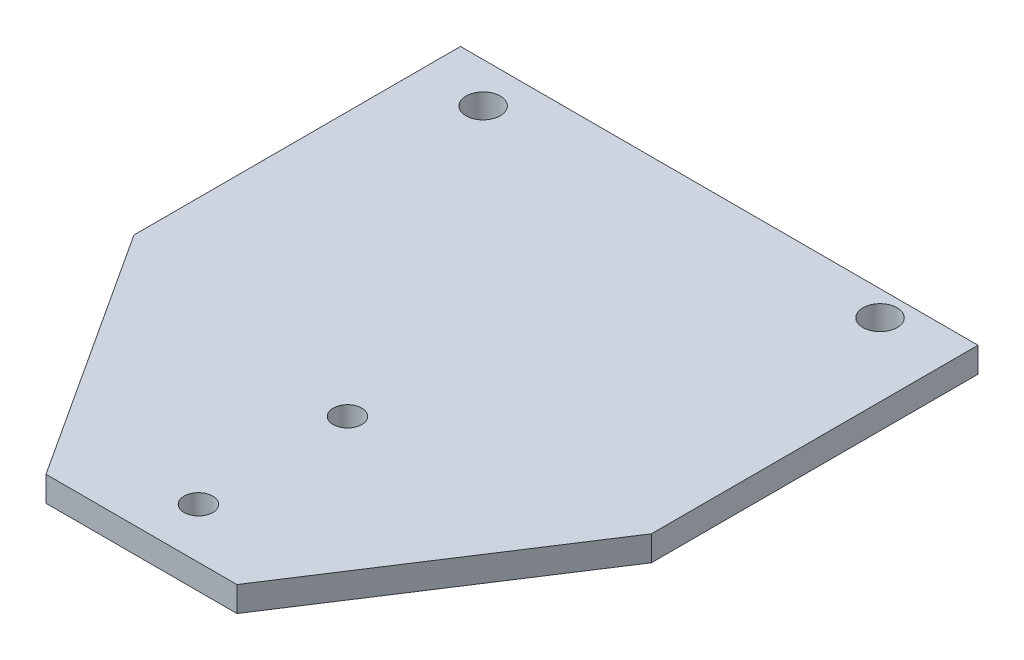
ISO-10303-21;
HEADER;
FILE_DESCRIPTION(('STEP AP214'),'2;1');
FILE_NAME('part.step','',(''),(''),'','','');
FILE_SCHEMA(('AUTOMOTIVE_DESIGN { 1 0 10303 214 1 1 1 1 }'));
ENDSEC;
DATA;
#1=APPLICATION_CONTEXT('core data for automotive mechanical design processes');
#2=APPLICATION_PROTOCOL_DEFINITION('international standard','automotive_design',2000,#1);
#3=PRODUCT_CONTEXT('',#1,'mechanical');
#4=PRODUCT('Part','Part','',(#3));
#5=PRODUCT_RELATED_PRODUCT_CATEGORY('part','',(#4));
#6=PRODUCT_DEFINITION_FORMATION('','',#4);
#7=PRODUCT_DEFINITION_CONTEXT('part definition',#1,'design');
#8=PRODUCT_DEFINITION('design','',#6,#7);
#9=PRODUCT_DEFINITION_SHAPE('','',#8);
#10=(LENGTH_UNIT() NAMED_UNIT(*) SI_UNIT(.MILLI.,.METRE.));
#11=(NAMED_UNIT(*) PLANE_ANGLE_UNIT() SI_UNIT($,.RADIAN.));
#12=(NAMED_UNIT(*) SI_UNIT($,.STERADIAN.) SOLID_ANGLE_UNIT());
#13=UNCERTAINTY_MEASURE_WITH_UNIT(LENGTH_MEASURE(1.E-05),#10,'distance_accuracy_value','');
#14=(GEOMETRIC_REPRESENTATION_CONTEXT(3) GLOBAL_UNCERTAINTY_ASSIGNED_CONTEXT((#13)) GLOBAL_UNIT_ASSIGNED_CONTEXT((#10,
#11,#12)) REPRESENTATION_CONTEXT('',''));
#15=CARTESIAN_POINT('',(0.,0.,0.));
#16=DIRECTION('',(0.,0.,1.));
#17=DIRECTION('',(1.,0.,0.));
#18=AXIS2_PLACEMENT_3D('',#15,#16,#17);
#19=CARTESIAN_POINT('',(0.,5.,0.));
#20=DIRECTION('',(0.,-1.,0.));
#21=DIRECTION('',(0.,0.,-1.));
#22=AXIS2_PLACEMENT_3D('',#19,#20,#21);
#23=PLANE('',#22);
#24=CARTESIAN_POINT('',(52.5113694055942,5.,10.));
#25=DIRECTION('',(0.,-1.,0.));
#26=DIRECTION('',(0.,0.,-1.));
#27=AXIS2_PLACEMENT_3D('',#24,#25,#26);
#28=CIRCLE('',#27,2.85);
#29=CARTESIAN_POINT('',(52.5113694055942,5.,7.15000000000002));
#30=VERTEX_POINT('',#29);
#31=EDGE_CURVE('E185',#30,#30,#28,.T.);
#32=ORIENTED_EDGE('',*,*,#31,.T.);
#33=EDGE_LOOP('',(#32));
#34=FACE_BOUND('',#33,.T.);
#35=CARTESIAN_POINT('',(52.8411637769836,5.,40.));
#36=DIRECTION('',(0.,-1.,0.));
#37=DIRECTION('',(0.,0.,-1.));
#38=AXIS2_PLACEMENT_3D('',#35,#36,#37);
#39=CIRCLE('',#38,2.85);
#40=CARTESIAN_POINT('',(52.8411637769836,5.,37.15));
#41=VERTEX_POINT('',#40);
#42=EDGE_CURVE('E187',#41,#41,#39,.T.);
#43=ORIENTED_EDGE('',*,*,#42,.T.);
#44=EDGE_LOOP('',(#43));
#45=FACE_BOUND('',#44,.T.);
#46=DIRECTION('',(0.544988350595414,0.,0.838443616300637));
#47=VECTOR('',#46,1.);
#48=CARTESIAN_POINT('',(32.5,5.,50.));
#49=LINE('',#48,#47);
#50=CARTESIAN_POINT('',(0.,5.,0.));
#51=VERTEX_POINT('',#50);
#52=CARTESIAN_POINT('',(32.5,5.,50.));
#53=VERTEX_POINT('',#52);
#54=EDGE_CURVE('E131',#51,#53,#49,.T.);
#55=ORIENTED_EDGE('',*,*,#54,.T.);
#56=DIRECTION('',(1.,0.,0.));
#57=VECTOR('',#56,1.);
#58=CARTESIAN_POINT('',(32.5,5.,50.));
#59=LINE('',#58,#57);
#60=CARTESIAN_POINT('',(70.5,5.,50.));
#61=VERTEX_POINT('',#60);
#62=EDGE_CURVE('E89',#53,#61,#59,.T.);
#63=ORIENTED_EDGE('',*,*,#62,.T.);
#64=DIRECTION('',(0.544988350595414,0.,-0.838443616300637));
#65=VECTOR('',#64,1.);
#66=CARTESIAN_POINT('',(70.5,5.,50.));
#67=LINE('',#66,#65);
#68=CARTESIAN_POINT('',(103.,5.,0.));
#69=VERTEX_POINT('',#68);
#70=EDGE_CURVE('E102',#61,#69,#67,.T.);
#71=ORIENTED_EDGE('',*,*,#70,.T.);
#72=DIRECTION('',(0.,0.,-1.));
#73=VECTOR('',#72,1.);
#74=CARTESIAN_POINT('',(103.,5.,0.));
#75=LINE('',#74,#73);
#76=CARTESIAN_POINT('',(103.,5.,-65.));
#77=VERTEX_POINT('',#76);
#78=EDGE_CURVE('E96',#69,#77,#75,.T.);
#79=ORIENTED_EDGE('',*,*,#78,.T.);
#80=DIRECTION('',(-1.,0.,0.));
#81=VECTOR('',#80,1.);
#82=CARTESIAN_POINT('',(0.,5.,-65.));
#83=LINE('',#82,#81);
#84=CARTESIAN_POINT('',(0.,5.,-65.));
#85=VERTEX_POINT('',#84);
#86=EDGE_CURVE('E100',#77,#85,#83,.T.);
#87=ORIENTED_EDGE('',*,*,#86,.T.);
#88=DIRECTION('',(0.,0.,1.));
#89=VECTOR('',#88,1.);
#90=CARTESIAN_POINT('',(0.,5.,0.));
#91=LINE('',#90,#89);
#92=EDGE_CURVE('E52',#85,#51,#91,.T.);
#93=ORIENTED_EDGE('',*,*,#92,.T.);
#94=EDGE_LOOP('',(#55,#63,#71,#79,#87,#93));
#95=FACE_BOUND('',#94,.T.);
#96=CARTESIAN_POINT('',(12.5,5.,-57.));
#97=DIRECTION('',(0.,1.,0.));
#98=DIRECTION('',(0.,0.,1.));
#99=AXIS2_PLACEMENT_3D('',#96,#97,#98);
#100=CIRCLE('',#99,3.415);
#101=CARTESIAN_POINT('',(12.5,5.,-53.585));
#102=VERTEX_POINT('',#101);
#103=EDGE_CURVE('E124',#102,#102,#100,.T.);
#104=ORIENTED_EDGE('',*,*,#103,.F.);
#105=EDGE_LOOP('',(#104));
#106=FACE_BOUND('',#105,.T.);
#107=CARTESIAN_POINT('',(88.5,5.,-60.));
#108=DIRECTION('',(0.,1.,0.));
#109=DIRECTION('',(0.,0.,1.));
#110=AXIS2_PLACEMENT_3D('',#107,#108,#109);
#111=CIRCLE('',#110,3.41509823187923);
#112=CARTESIAN_POINT('',(88.5,5.,-56.5849017681208));
#113=VERTEX_POINT('',#112);
#114=EDGE_CURVE('E190',#113,#113,#111,.T.);
#115=ORIENTED_EDGE('',*,*,#114,.F.);
#116=EDGE_LOOP('',(#115));
#117=FACE_BOUND('',#116,.T.);
#118=ADVANCED_FACE('F35',(#34,#45,#95,#106,#117),#23,.F.);
#119=CARTESIAN_POINT('',(0.,0.,0.));
#120=DIRECTION('',(0.,-1.,0.));
#121=DIRECTION('',(0.,0.,-1.));
#122=AXIS2_PLACEMENT_3D('',#119,#120,#121);
#123=PLANE('',#122);
#124=CARTESIAN_POINT('',(52.5113694055942,0.,10.));
#125=DIRECTION('',(0.,1.,0.));
#126=DIRECTION('',(0.,0.,1.));
#127=AXIS2_PLACEMENT_3D('',#124,#125,#126);
#128=CIRCLE('',#127,2.85);
#129=CARTESIAN_POINT('',(52.5113694055942,0.,12.85));
#130=VERTEX_POINT('',#129);
#131=EDGE_CURVE('E183',#130,#130,#128,.T.);
#132=ORIENTED_EDGE('',*,*,#131,.T.);
#133=EDGE_LOOP('',(#132));
#134=FACE_BOUND('',#133,.T.);
#135=CARTESIAN_POINT('',(52.8411637769836,0.,40.));
#136=DIRECTION('',(0.,1.,0.));
#137=DIRECTION('',(0.,0.,1.));
#138=AXIS2_PLACEMENT_3D('',#135,#136,#137);
#139=CIRCLE('',#138,2.85);
#140=CARTESIAN_POINT('',(52.8411637769836,0.,42.85));
#141=VERTEX_POINT('',#140);
#142=EDGE_CURVE('E212',#141,#141,#139,.T.);
#143=ORIENTED_EDGE('',*,*,#142,.T.);
#144=EDGE_LOOP('',(#143));
#145=FACE_BOUND('',#144,.T.);
#146=CARTESIAN_POINT('',(12.5,0.,-57.));
#147=DIRECTION('',(0.,1.,0.));
#148=DIRECTION('',(0.,0.,1.));
#149=AXIS2_PLACEMENT_3D('',#146,#147,#148);
#150=CIRCLE('',#149,3.415);
#151=CARTESIAN_POINT('',(12.5,0.,-53.585));
#152=VERTEX_POINT('',#151);
#153=EDGE_CURVE('E197',#152,#152,#150,.T.);
#154=ORIENTED_EDGE('',*,*,#153,.T.);
#155=EDGE_LOOP('',(#154));
#156=FACE_BOUND('',#155,.T.);
#157=DIRECTION('',(0.544988350595414,0.,0.838443616300637));
#158=VECTOR('',#157,1.);
#159=CARTESIAN_POINT('',(32.5,0.,50.));
#160=LINE('',#159,#158);
#161=CARTESIAN_POINT('',(0.,0.,0.));
#162=VERTEX_POINT('',#161);
#163=CARTESIAN_POINT('',(32.5,0.,50.));
#164=VERTEX_POINT('',#163);
#165=EDGE_CURVE('E120',#162,#164,#160,.T.);
#166=ORIENTED_EDGE('',*,*,#165,.F.);
#167=DIRECTION('',(0.,0.,1.));
#168=VECTOR('',#167,1.);
#169=CARTESIAN_POINT('',(0.,0.,0.));
#170=LINE('',#169,#168);
#171=CARTESIAN_POINT('',(0.,0.,-65.));
#172=VERTEX_POINT('',#171);
#173=EDGE_CURVE('E81',#172,#162,#170,.T.);
#174=ORIENTED_EDGE('',*,*,#173,.F.);
#175=DIRECTION('',(-1.,0.,0.));
#176=VECTOR('',#175,1.);
#177=CARTESIAN_POINT('',(0.,0.,-65.));
#178=LINE('',#177,#176);
#179=CARTESIAN_POINT('',(103.,0.,-65.));
#180=VERTEX_POINT('',#179);
#181=EDGE_CURVE('E75',#180,#172,#178,.T.);
#182=ORIENTED_EDGE('',*,*,#181,.F.);
#183=DIRECTION('',(0.,0.,-1.));
#184=VECTOR('',#183,1.);
#185=CARTESIAN_POINT('',(103.,0.,0.));
#186=LINE('',#185,#184);
#187=CARTESIAN_POINT('',(103.,0.,0.));
#188=VERTEX_POINT('',#187);
#189=EDGE_CURVE('E110',#188,#180,#186,.T.);
#190=ORIENTED_EDGE('',*,*,#189,.F.);
#191=DIRECTION('',(0.544988350595414,0.,-0.838443616300637));
#192=VECTOR('',#191,1.);
#193=CARTESIAN_POINT('',(70.5,0.,50.));
#194=LINE('',#193,#192);
#195=CARTESIAN_POINT('',(70.5,0.,50.));
#196=VERTEX_POINT('',#195);
#197=EDGE_CURVE('E126',#196,#188,#194,.T.);
#198=ORIENTED_EDGE('',*,*,#197,.F.);
#199=DIRECTION('',(1.,0.,0.));
#200=VECTOR('',#199,1.);
#201=CARTESIAN_POINT('',(32.5,0.,50.));
#202=LINE('',#201,#200);
#203=EDGE_CURVE('E123',#164,#196,#202,.T.);
#204=ORIENTED_EDGE('',*,*,#203,.F.);
#205=EDGE_LOOP('',(#166,#174,#182,#190,#198,#204));
#206=FACE_BOUND('',#205,.T.);
#207=CARTESIAN_POINT('',(88.5,0.,-60.));
#208=DIRECTION('',(0.,1.,0.));
#209=DIRECTION('',(0.,0.,1.));
#210=AXIS2_PLACEMENT_3D('',#207,#208,#209);
#211=CIRCLE('',#210,3.41509823187923);
#212=CARTESIAN_POINT('',(88.5,0.,-56.5849017681208));
#213=VERTEX_POINT('',#212);
#214=EDGE_CURVE('E186',#213,#213,#211,.T.);
#215=ORIENTED_EDGE('',*,*,#214,.T.);
#216=EDGE_LOOP('',(#215));
#217=FACE_BOUND('',#216,.T.);
#218=ADVANCED_FACE('F140',(#134,#145,#156,#206,#217),#123,.T.);
#219=CARTESIAN_POINT('',(32.5,5.,50.));
#220=DIRECTION('',(0.838443616300637,0.,-0.544988350595414));
#221=DIRECTION('',(-0.544988350595414,0.,-0.838443616300637));
#222=AXIS2_PLACEMENT_3D('',#219,#220,#221);
#223=PLANE('',#222);
#224=ORIENTED_EDGE('',*,*,#165,.T.);
#225=DIRECTION('',(0.,-1.,0.));
#226=VECTOR('',#225,1.);
#227=CARTESIAN_POINT('',(32.5,5.,50.));
#228=LINE('',#227,#226);
#229=EDGE_CURVE('E11',#53,#164,#228,.T.);
#230=ORIENTED_EDGE('',*,*,#229,.F.);
#231=ORIENTED_EDGE('',*,*,#54,.F.);
#232=DIRECTION('',(0.,-1.,0.));
#233=VECTOR('',#232,1.);
#234=CARTESIAN_POINT('',(0.,5.,0.));
#235=LINE('',#234,#233);
#236=EDGE_CURVE('E116',#51,#162,#235,.T.);
#237=ORIENTED_EDGE('',*,*,#236,.T.);
#238=EDGE_LOOP('',(#224,#230,#231,#237));
#239=FACE_BOUND('',#238,.T.);
#240=ADVANCED_FACE('F37',(#239),#223,.F.);
#241=CARTESIAN_POINT('',(32.5,5.,50.));
#242=DIRECTION('',(0.,0.,-1.));
#243=DIRECTION('',(-1.,0.,0.));
#244=AXIS2_PLACEMENT_3D('',#241,#242,#243);
#245=PLANE('',#244);
#246=ORIENTED_EDGE('',*,*,#203,.T.);
#247=DIRECTION('',(0.,-1.,0.));
#248=VECTOR('',#247,1.);
#249=CARTESIAN_POINT('',(70.5,5.,50.));
#250=LINE('',#249,#248);
#251=EDGE_CURVE('E44',#61,#196,#250,.T.);
#252=ORIENTED_EDGE('',*,*,#251,.F.);
#253=ORIENTED_EDGE('',*,*,#62,.F.);
#254=ORIENTED_EDGE('',*,*,#229,.T.);
#255=EDGE_LOOP('',(#246,#252,#253,#254));
#256=FACE_BOUND('',#255,.T.);
#257=ADVANCED_FACE('F259',(#256),#245,.F.);
#258=CARTESIAN_POINT('',(70.5,5.,50.));
#259=DIRECTION('',(-0.838443616300637,0.,-0.544988350595414));
#260=DIRECTION('',(-0.544988350595414,0.,0.838443616300637));
#261=AXIS2_PLACEMENT_3D('',#258,#259,#260);
#262=PLANE('',#261);
#263=ORIENTED_EDGE('',*,*,#197,.T.);
#264=DIRECTION('',(0.,-1.,0.));
#265=VECTOR('',#264,1.);
#266=CARTESIAN_POINT('',(103.,5.,0.));
#267=LINE('',#266,#265);
#268=EDGE_CURVE('E111',#69,#188,#267,.T.);
#269=ORIENTED_EDGE('',*,*,#268,.F.);
#270=ORIENTED_EDGE('',*,*,#70,.F.);
#271=ORIENTED_EDGE('',*,*,#251,.T.);
#272=EDGE_LOOP('',(#263,#269,#270,#271));
#273=FACE_BOUND('',#272,.T.);
#274=ADVANCED_FACE('F137',(#273),#262,.F.);
#275=CARTESIAN_POINT('',(103.,5.,0.));
#276=DIRECTION('',(-1.,0.,0.));
#277=DIRECTION('',(0.,0.,1.));
#278=AXIS2_PLACEMENT_3D('',#275,#276,#277);
#279=PLANE('',#278);
#280=ORIENTED_EDGE('',*,*,#189,.T.);
#281=DIRECTION('',(0.,-1.,0.));
#282=VECTOR('',#281,1.);
#283=CARTESIAN_POINT('',(103.,5.,-65.));
#284=LINE('',#283,#282);
#285=EDGE_CURVE('E107',#77,#180,#284,.T.);
#286=ORIENTED_EDGE('',*,*,#285,.F.);
#287=ORIENTED_EDGE('',*,*,#78,.F.);
#288=ORIENTED_EDGE('',*,*,#268,.T.);
#289=EDGE_LOOP('',(#280,#286,#287,#288));
#290=FACE_BOUND('',#289,.T.);
#291=ADVANCED_FACE('F108',(#290),#279,.F.);
#292=CARTESIAN_POINT('',(0.,5.,-65.));
#293=DIRECTION('',(0.,0.,1.));
#294=DIRECTION('',(1.,0.,0.));
#295=AXIS2_PLACEMENT_3D('',#292,#293,#294);
#296=PLANE('',#295);
#297=ORIENTED_EDGE('',*,*,#181,.T.);
#298=DIRECTION('',(0.,-1.,0.));
#299=VECTOR('',#298,1.);
#300=CARTESIAN_POINT('',(0.,5.,-65.));
#301=LINE('',#300,#299);
#302=EDGE_CURVE('E112',#85,#172,#301,.T.);
#303=ORIENTED_EDGE('',*,*,#302,.F.);
#304=ORIENTED_EDGE('',*,*,#86,.F.);
#305=ORIENTED_EDGE('',*,*,#285,.T.);
#306=EDGE_LOOP('',(#297,#303,#304,#305));
#307=FACE_BOUND('',#306,.T.);
#308=ADVANCED_FACE('F114',(#307),#296,.F.);
#309=CARTESIAN_POINT('',(0.,5.,0.));
#310=DIRECTION('',(1.,0.,0.));
#311=DIRECTION('',(0.,0.,-1.));
#312=AXIS2_PLACEMENT_3D('',#309,#310,#311);
#313=PLANE('',#312);
#314=ORIENTED_EDGE('',*,*,#173,.T.);
#315=ORIENTED_EDGE('',*,*,#236,.F.);
#316=ORIENTED_EDGE('',*,*,#92,.F.);
#317=ORIENTED_EDGE('',*,*,#302,.T.);
#318=EDGE_LOOP('',(#314,#315,#316,#317));
#319=FACE_BOUND('',#318,.T.);
#320=ADVANCED_FACE('F145',(#319),#313,.F.);
#321=CARTESIAN_POINT('',(12.5,5.,-57.));
#322=DIRECTION('',(0.,-1.,0.));
#323=DIRECTION('',(0.,0.,-1.));
#324=AXIS2_PLACEMENT_3D('',#321,#322,#323);
#325=CYLINDRICAL_SURFACE('',#324,3.415);
#326=ORIENTED_EDGE('',*,*,#103,.T.);
#327=EDGE_LOOP('',(#326));
#328=FACE_BOUND('',#327,.T.);
#329=ORIENTED_EDGE('',*,*,#153,.F.);
#330=EDGE_LOOP('',(#329));
#331=FACE_BOUND('',#330,.T.);
#332=ADVANCED_FACE('F147',(#328,#331),#325,.F.);
#333=CARTESIAN_POINT('',(88.5,5.,-60.));
#334=DIRECTION('',(0.,-1.,0.));
#335=DIRECTION('',(0.,0.,-1.));
#336=AXIS2_PLACEMENT_3D('',#333,#334,#335);
#337=CYLINDRICAL_SURFACE('',#336,3.41509823187923);
#338=ORIENTED_EDGE('',*,*,#114,.T.);
#339=EDGE_LOOP('',(#338));
#340=FACE_BOUND('',#339,.T.);
#341=ORIENTED_EDGE('',*,*,#214,.F.);
#342=EDGE_LOOP('',(#341));
#343=FACE_BOUND('',#342,.T.);
#344=ADVANCED_FACE('F153',(#340,#343),#337,.F.);
#345=CARTESIAN_POINT('',(52.8411637769836,0.,40.));
#346=DIRECTION('',(0.,1.,0.));
#347=DIRECTION('',(0.,0.,1.));
#348=AXIS2_PLACEMENT_3D('',#345,#346,#347);
#349=CYLINDRICAL_SURFACE('',#348,2.85);
#350=ORIENTED_EDGE('',*,*,#142,.F.);
#351=EDGE_LOOP('',(#350));
#352=FACE_BOUND('',#351,.T.);
#353=ORIENTED_EDGE('',*,*,#42,.F.);
#354=EDGE_LOOP('',(#353));
#355=FACE_BOUND('',#354,.T.);
#356=ADVANCED_FACE('F170',(#352,#355),#349,.F.);
#357=CARTESIAN_POINT('',(52.5113694055942,0.,10.));
#358=DIRECTION('',(0.,1.,0.));
#359=DIRECTION('',(0.,0.,1.));
#360=AXIS2_PLACEMENT_3D('',#357,#358,#359);
#361=CYLINDRICAL_SURFACE('',#360,2.85);
#362=ORIENTED_EDGE('',*,*,#131,.F.);
#363=EDGE_LOOP('',(#362));
#364=FACE_BOUND('',#363,.T.);
#365=ORIENTED_EDGE('',*,*,#31,.F.);
#366=EDGE_LOOP('',(#365));
#367=FACE_BOUND('',#366,.T.);
#368=ADVANCED_FACE('F174',(#364,#367),#361,.F.);
#369=CLOSED_SHELL('',(#118,#218,#240,#257,#274,#291,#308,#320,#332,#344,#356,#368));
#370=MANIFOLD_SOLID_BREP('B2',#369);
#371=ADVANCED_BREP_SHAPE_REPRESENTATION('',(#18,#370),#14);
#372=SHAPE_DEFINITION_REPRESENTATION(#9,#371);
ENDSEC;
END-ISO-10303-21;
